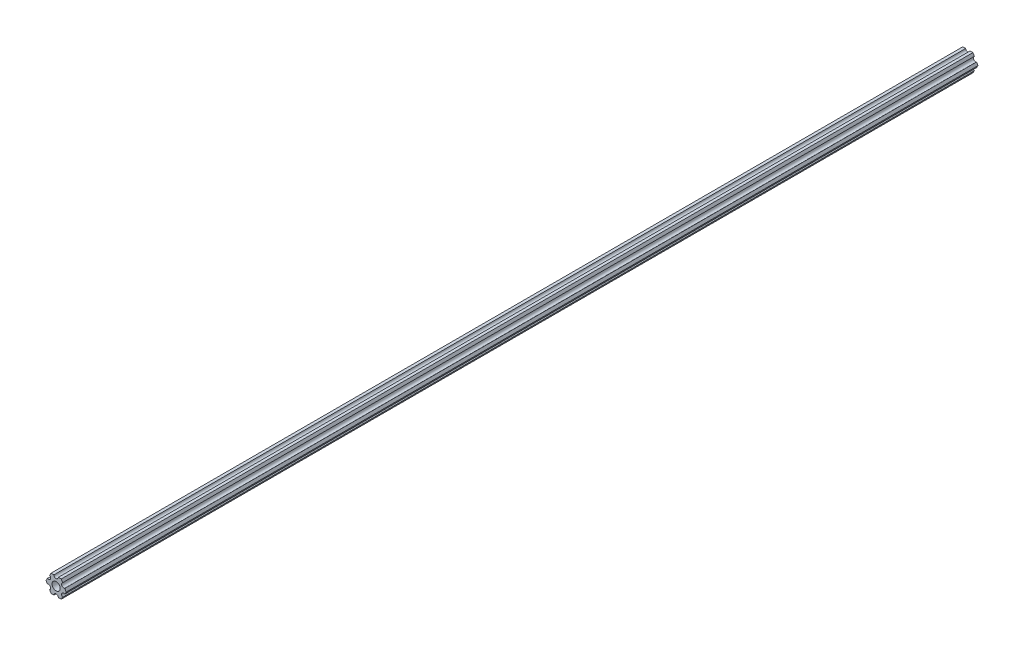
ISO-10303-21;
HEADER;
FILE_DESCRIPTION(('STEP AP214'),'2;1');
FILE_NAME('part.step','',(''),(''),'','','');
FILE_SCHEMA(('AUTOMOTIVE_DESIGN { 1 0 10303 214 1 1 1 1 }'));
ENDSEC;
DATA;
#1=APPLICATION_CONTEXT('core data for automotive mechanical design processes');
#2=APPLICATION_PROTOCOL_DEFINITION('international standard','automotive_design',2000,#1);
#3=PRODUCT_CONTEXT('',#1,'mechanical');
#4=PRODUCT('Part','Part','',(#3));
#5=PRODUCT_RELATED_PRODUCT_CATEGORY('part','',(#4));
#6=PRODUCT_DEFINITION_FORMATION('','',#4);
#7=PRODUCT_DEFINITION_CONTEXT('part definition',#1,'design');
#8=PRODUCT_DEFINITION('design','',#6,#7);
#9=PRODUCT_DEFINITION_SHAPE('','',#8);
#10=(LENGTH_UNIT() NAMED_UNIT(*) SI_UNIT(.MILLI.,.METRE.));
#11=(NAMED_UNIT(*) PLANE_ANGLE_UNIT() SI_UNIT($,.RADIAN.));
#12=(NAMED_UNIT(*) SI_UNIT($,.STERADIAN.) SOLID_ANGLE_UNIT());
#13=UNCERTAINTY_MEASURE_WITH_UNIT(LENGTH_MEASURE(1.E-05),#10,'distance_accuracy_value','');
#14=(GEOMETRIC_REPRESENTATION_CONTEXT(3) GLOBAL_UNCERTAINTY_ASSIGNED_CONTEXT((#13)) GLOBAL_UNIT_ASSIGNED_CONTEXT((#10,
#11,#12)) REPRESENTATION_CONTEXT('',''));
#15=CARTESIAN_POINT('',(0.,0.,0.));
#16=DIRECTION('',(0.,0.,1.));
#17=DIRECTION('',(1.,0.,0.));
#18=AXIS2_PLACEMENT_3D('',#15,#16,#17);
#19=CARTESIAN_POINT('',(6.29301142309098,-1.80018429024546,85.725));
#20=DIRECTION('',(-0.866025434075723,0.499999947533953,0.));
#21=DIRECTION('',(0.,0.,1.));
#22=AXIS2_PLACEMENT_3D('',#19,#20,#21);
#23=PLANE('',#22);
#24=DIRECTION('',(0.,0.,1.));
#25=VECTOR('',#24,1.);
#26=CARTESIAN_POINT('',(7.33234841870827,4.44212519169686E-07,85.725));
#27=LINE('',#26,#25);
#28=CARTESIAN_POINT('',(7.33234841870826,4.44212518961143E-07,-574.675));
#29=VERTEX_POINT('',#28);
#30=CARTESIAN_POINT('',(7.33234841870826,4.44212519315656E-07,85.725));
#31=VERTEX_POINT('',#30);
#32=EDGE_CURVE('E11',#29,#31,#27,.T.);
#33=ORIENTED_EDGE('',*,*,#32,.T.);
#34=DIRECTION('',(0.499999947533953,0.866025434075723,0.));
#35=VECTOR('',#34,1.);
#36=CARTESIAN_POINT('',(6.29301142309098,-1.80018429024546,85.725));
#37=LINE('',#36,#35);
#38=CARTESIAN_POINT('',(6.29301142309098,-1.80018429024546,85.725));
#39=VERTEX_POINT('',#38);
#40=EDGE_CURVE('E301',#39,#31,#37,.T.);
#41=ORIENTED_EDGE('',*,*,#40,.F.);
#42=DIRECTION('',(0.,0.,-1.));
#43=VECTOR('',#42,1.);
#44=CARTESIAN_POINT('',(6.29301142309098,-1.80018429024546,85.725));
#45=LINE('',#44,#43);
#46=CARTESIAN_POINT('',(6.29301142309098,-1.80018429024546,-574.675));
#47=VERTEX_POINT('',#46);
#48=EDGE_CURVE('E300',#39,#47,#45,.T.);
#49=ORIENTED_EDGE('',*,*,#48,.T.);
#50=DIRECTION('',(-0.499999947533953,-0.866025434075723,0.));
#51=VECTOR('',#50,1.);
#52=CARTESIAN_POINT('',(6.29301142309098,-1.80018429024546,-574.675));
#53=LINE('',#52,#51);
#54=EDGE_CURVE('E219',#29,#47,#53,.T.);
#55=ORIENTED_EDGE('',*,*,#54,.F.);
#56=EDGE_LOOP('',(#33,#41,#49,#55));
#57=FACE_BOUND('',#56,.T.);
#58=ADVANCED_FACE('F51',(#57),#23,.F.);
#59=CARTESIAN_POINT('',(7.33234841870827,4.44212519169686E-07,85.725));
#60=DIRECTION('',(-0.866025373493145,-0.500000052466057,0.));
#61=DIRECTION('',(-0.500000052466057,0.866025373493145,0.));
#62=AXIS2_PLACEMENT_3D('',#59,#60,#61);
#63=PLANE('',#62);
#64=DIRECTION('',(0.,0.,1.));
#65=VECTOR('',#64,1.);
#66=CARTESIAN_POINT('',(6.29301120497139,1.80018505273894,85.725));
#67=LINE('',#66,#65);
#68=CARTESIAN_POINT('',(6.29301120497139,1.80018505273894,-574.675));
#69=VERTEX_POINT('',#68);
#70=CARTESIAN_POINT('',(6.29301120497139,1.80018505273894,85.725));
#71=VERTEX_POINT('',#70);
#72=EDGE_CURVE('E59',#69,#71,#67,.T.);
#73=ORIENTED_EDGE('',*,*,#72,.T.);
#74=DIRECTION('',(-0.500000052466057,0.866025373493145,0.));
#75=VECTOR('',#74,1.);
#76=CARTESIAN_POINT('',(7.33234841870827,4.44212519198906E-07,85.725));
#77=LINE('',#76,#75);
#78=EDGE_CURVE('E305',#31,#71,#77,.T.);
#79=ORIENTED_EDGE('',*,*,#78,.F.);
#80=ORIENTED_EDGE('',*,*,#32,.F.);
#81=DIRECTION('',(0.500000052466055,-0.866025373493145,0.));
#82=VECTOR('',#81,1.);
#83=CARTESIAN_POINT('',(7.33234841870826,4.44212518961143E-07,-574.675));
#84=LINE('',#83,#82);
#85=EDGE_CURVE('E213',#69,#29,#84,.T.);
#86=ORIENTED_EDGE('',*,*,#85,.F.);
#87=EDGE_LOOP('',(#73,#79,#80,#86));
#88=FACE_BOUND('',#87,.T.);
#89=ADVANCED_FACE('F214',(#88),#63,.F.);
#90=CARTESIAN_POINT('',(4.70551103839172,4.54981561357972,85.725));
#91=DIRECTION('',(-0.866025373493151,-0.500000052466046,0.));
#92=DIRECTION('',(-0.500000052466046,0.866025373493151,0.));
#93=AXIS2_PLACEMENT_3D('',#90,#91,#92);
#94=PLANE('',#93);
#95=DIRECTION('',(0.,0.,1.));
#96=VECTOR('',#95,1.);
#97=CARTESIAN_POINT('',(3.66617382465481,6.35000022210627,85.725));
#98=LINE('',#97,#96);
#99=CARTESIAN_POINT('',(3.66617382465481,6.35000022210627,-574.675));
#100=VERTEX_POINT('',#99);
#101=CARTESIAN_POINT('',(3.66617382465481,6.35000022210627,85.725));
#102=VERTEX_POINT('',#101);
#103=EDGE_CURVE('E211',#100,#102,#98,.T.);
#104=ORIENTED_EDGE('',*,*,#103,.T.);
#105=DIRECTION('',(-0.500000052466046,0.866025373493151,0.));
#106=VECTOR('',#105,1.);
#107=CARTESIAN_POINT('',(4.70551103839172,4.54981561357972,85.725));
#108=LINE('',#107,#106);
#109=CARTESIAN_POINT('',(4.70551103839172,4.54981561357972,85.725));
#110=VERTEX_POINT('',#109);
#111=EDGE_CURVE('E336',#110,#102,#108,.T.);
#112=ORIENTED_EDGE('',*,*,#111,.F.);
#113=DIRECTION('',(0.,0.,1.));
#114=VECTOR('',#113,1.);
#115=CARTESIAN_POINT('',(4.70551103839172,4.54981561357972,85.725));
#116=LINE('',#115,#114);
#117=CARTESIAN_POINT('',(4.70551103839172,4.54981561357972,-574.675));
#118=VERTEX_POINT('',#117);
#119=EDGE_CURVE('E299',#118,#110,#116,.T.);
#120=ORIENTED_EDGE('',*,*,#119,.F.);
#121=DIRECTION('',(0.500000052466045,-0.866025373493151,0.));
#122=VECTOR('',#121,1.);
#123=CARTESIAN_POINT('',(4.70551103839172,4.54981561357972,-574.675));
#124=LINE('',#123,#122);
#125=EDGE_CURVE('E225',#100,#118,#124,.T.);
#126=ORIENTED_EDGE('',*,*,#125,.F.);
#127=EDGE_LOOP('',(#104,#112,#120,#126));
#128=FACE_BOUND('',#127,.T.);
#129=ADVANCED_FACE('F412',(#128),#94,.F.);
#130=CARTESIAN_POINT('',(3.66617382465481,6.35000022210627,85.725));
#131=DIRECTION('',(6.05825850611185E-08,-1.,0.));
#132=DIRECTION('',(0.,0.,-1.));
#133=AXIS2_PLACEMENT_3D('',#130,#131,#132);
#134=PLANE('',#133);
#135=DIRECTION('',(0.,0.,1.));
#136=VECTOR('',#135,1.);
#137=CARTESIAN_POINT('',(1.58749961530074,6.35000009617482,85.725));
#138=LINE('',#137,#136);
#139=CARTESIAN_POINT('',(1.58749961530073,6.35000015914054,-574.675));
#140=VERTEX_POINT('',#139);
#141=CARTESIAN_POINT('',(1.58749961530073,6.35000015914054,85.725));
#142=VERTEX_POINT('',#141);
#143=EDGE_CURVE('E333',#140,#142,#138,.T.);
#144=ORIENTED_EDGE('',*,*,#143,.T.);
#145=DIRECTION('',(-1.,0.,0.));
#146=VECTOR('',#145,1.);
#147=CARTESIAN_POINT('',(5.49926112168156,6.35000022210627,85.725));
#148=LINE('',#147,#146);
#149=EDGE_CURVE('E340',#102,#142,#148,.T.);
#150=ORIENTED_EDGE('',*,*,#149,.F.);
#151=ORIENTED_EDGE('',*,*,#103,.F.);
#152=DIRECTION('',(1.,3.02912931564594E-08,0.));
#153=VECTOR('',#152,1.);
#154=CARTESIAN_POINT('',(3.66617382465481,6.35000022210627,-574.675));
#155=LINE('',#154,#153);
#156=EDGE_CURVE('E287',#140,#100,#155,.T.);
#157=ORIENTED_EDGE('',*,*,#156,.F.);
#158=EDGE_LOOP('',(#144,#150,#151,#157));
#159=FACE_BOUND('',#158,.T.);
#160=ADVANCED_FACE('F415',(#159),#134,.F.);
#161=CARTESIAN_POINT('',(-3.84699260060323E-07,6.35,85.725));
#162=DIRECTION('',(0.,0.,-1.));
#163=DIRECTION('',(-1.,0.,0.));
#164=AXIS2_PLACEMENT_3D('',#161,#162,#163);
#165=CYLINDRICAL_SURFACE('',#164,1.5875);
#166=DIRECTION('',(0.,0.,1.));
#167=VECTOR('',#166,1.);
#168=CARTESIAN_POINT('',(-1.58750038469926,6.34999990382518,85.725));
#169=LINE('',#168,#167);
#170=CARTESIAN_POINT('',(-1.58750038469926,6.34999990382519,-574.675));
#171=VERTEX_POINT('',#170);
#172=CARTESIAN_POINT('',(-1.58750038469926,6.34999990382519,85.725));
#173=VERTEX_POINT('',#172);
#174=EDGE_CURVE('E330',#171,#173,#169,.T.);
#175=ORIENTED_EDGE('',*,*,#174,.T.);
#176=CARTESIAN_POINT('',(-3.84699260060323E-07,6.35,85.725));
#177=DIRECTION('',(0.,0.,-1.));
#178=DIRECTION('',(-1.,0.,0.));
#179=AXIS2_PLACEMENT_3D('',#176,#177,#178);
#180=CIRCLE('',#179,1.5875);
#181=EDGE_CURVE('E344',#142,#173,#180,.T.);
#182=ORIENTED_EDGE('',*,*,#181,.F.);
#183=ORIENTED_EDGE('',*,*,#143,.F.);
#184=CARTESIAN_POINT('',(-3.84699260060323E-07,6.35,-574.675));
#185=DIRECTION('',(0.,0.,1.));
#186=DIRECTION('',(-1.,0.,0.));
#187=AXIS2_PLACEMENT_3D('',#184,#185,#186);
#188=CIRCLE('',#187,1.5875);
#189=EDGE_CURVE('E283',#171,#140,#188,.T.);
#190=ORIENTED_EDGE('',*,*,#189,.F.);
#191=EDGE_LOOP('',(#175,#182,#183,#190));
#192=FACE_BOUND('',#191,.T.);
#193=ADVANCED_FACE('F464',(#192),#165,.F.);
#194=CARTESIAN_POINT('',(-1.58750038469926,6.34999990382518,85.725));
#195=DIRECTION('',(6.05825963273174E-08,-1.,0.));
#196=DIRECTION('',(0.,0.,-1.));
#197=AXIS2_PLACEMENT_3D('',#194,#195,#196);
#198=PLANE('',#197);
#199=DIRECTION('',(0.,0.,1.));
#200=VECTOR('',#199,1.);
#201=CARTESIAN_POINT('',(-3.66617459405349,6.3499997778937,85.725));
#202=LINE('',#201,#200);
#203=CARTESIAN_POINT('',(-3.66617454558244,6.34999986184803,-574.675));
#204=VERTEX_POINT('',#203);
#205=CARTESIAN_POINT('',(-3.66617454558244,6.34999986184803,85.725));
#206=VERTEX_POINT('',#205);
#207=EDGE_CURVE('E323',#204,#206,#202,.T.);
#208=ORIENTED_EDGE('',*,*,#207,.T.);
#209=DIRECTION('',(-1.,0.,0.));
#210=VECTOR('',#209,1.);
#211=CARTESIAN_POINT('',(5.49926112168156,6.34999990382519,85.725));
#212=LINE('',#211,#210);
#213=EDGE_CURVE('E348',#173,#206,#212,.T.);
#214=ORIENTED_EDGE('',*,*,#213,.F.);
#215=ORIENTED_EDGE('',*,*,#174,.F.);
#216=DIRECTION('',(1.,2.0194198968488E-08,0.));
#217=VECTOR('',#216,1.);
#218=CARTESIAN_POINT('',(-1.58750038469926,6.34999990382519,-574.675));
#219=LINE('',#218,#217);
#220=EDGE_CURVE('E279',#204,#171,#219,.T.);
#221=ORIENTED_EDGE('',*,*,#220,.F.);
#222=EDGE_LOOP('',(#208,#214,#215,#221));
#223=FACE_BOUND('',#222,.T.);
#224=ADVANCED_FACE('F461',(#223),#198,.F.);
#225=CARTESIAN_POINT('',(-3.66617459405349,6.3499997778937,85.725));
#226=DIRECTION('',(0.866025434075729,-0.499999947533942,0.));
#227=DIRECTION('',(0.,0.,-1.));
#228=AXIS2_PLACEMENT_3D('',#225,#226,#227);
#229=PLANE('',#228);
#230=DIRECTION('',(0.,0.,1.));
#231=VECTOR('',#230,1.);
#232=CARTESIAN_POINT('',(-4.70551158967065,4.54981504343587,85.725));
#233=LINE('',#232,#231);
#234=CARTESIAN_POINT('',(-4.70551158967065,4.54981504343587,-574.675));
#235=VERTEX_POINT('',#234);
#236=CARTESIAN_POINT('',(-4.70551158967065,4.54981504343587,85.725));
#237=VERTEX_POINT('',#236);
#238=EDGE_CURVE('E320',#235,#237,#233,.T.);
#239=ORIENTED_EDGE('',*,*,#238,.T.);
#240=DIRECTION('',(-0.499999947533943,-0.866025434075729,0.));
#241=VECTOR('',#240,1.);
#242=CARTESIAN_POINT('',(-3.66617459405349,6.3499997778937,85.725));
#243=LINE('',#242,#241);
#244=EDGE_CURVE('E352',#206,#237,#243,.T.);
#245=ORIENTED_EDGE('',*,*,#244,.F.);
#246=ORIENTED_EDGE('',*,*,#207,.F.);
#247=DIRECTION('',(0.499999947533939,0.866025434075731,0.));
#248=VECTOR('',#247,1.);
#249=CARTESIAN_POINT('',(-3.66617454558244,6.34999986184803,-574.675));
#250=LINE('',#249,#248);
#251=EDGE_CURVE('E275',#235,#204,#250,.T.);
#252=ORIENTED_EDGE('',*,*,#251,.F.);
#253=EDGE_LOOP('',(#239,#245,#246,#252));
#254=FACE_BOUND('',#253,.T.);
#255=ADVANCED_FACE('F457',(#254),#229,.F.);
#256=CARTESIAN_POINT('',(-5.49926150638082,3.17499966684067,85.725));
#257=DIRECTION('',(0.,0.,-1.));
#258=DIRECTION('',(-1.,0.,0.));
#259=AXIS2_PLACEMENT_3D('',#256,#257,#258);
#260=CYLINDRICAL_SURFACE('',#259,1.5875);
#261=DIRECTION('',(0.,0.,1.));
#262=VECTOR('',#261,1.);
#263=CARTESIAN_POINT('',(-6.29301142309098,1.80018429024547,85.725));
#264=LINE('',#263,#262);
#265=CARTESIAN_POINT('',(-6.29301142309098,1.80018429024546,-574.675));
#266=VERTEX_POINT('',#265);
#267=CARTESIAN_POINT('',(-6.29301142309098,1.80018429024547,85.725));
#268=VERTEX_POINT('',#267);
#269=EDGE_CURVE('E324',#266,#268,#264,.T.);
#270=ORIENTED_EDGE('',*,*,#269,.T.);
#271=CARTESIAN_POINT('',(-5.49926150638082,3.17499966684067,85.725));
#272=DIRECTION('',(0.,0.,-1.));
#273=DIRECTION('',(-1.,0.,0.));
#274=AXIS2_PLACEMENT_3D('',#271,#272,#273);
#275=CIRCLE('',#274,1.5875);
#276=EDGE_CURVE('E362',#237,#268,#275,.T.);
#277=ORIENTED_EDGE('',*,*,#276,.F.);
#278=ORIENTED_EDGE('',*,*,#238,.F.);
#279=CARTESIAN_POINT('',(-5.49926150638082,3.17499966684067,-574.675));
#280=DIRECTION('',(0.,0.,1.));
#281=DIRECTION('',(-1.,0.,0.));
#282=AXIS2_PLACEMENT_3D('',#279,#280,#281);
#283=CIRCLE('',#282,1.5875);
#284=EDGE_CURVE('E271',#266,#235,#283,.T.);
#285=ORIENTED_EDGE('',*,*,#284,.F.);
#286=EDGE_LOOP('',(#270,#277,#278,#285));
#287=FACE_BOUND('',#286,.T.);
#288=ADVANCED_FACE('F453',(#287),#260,.F.);
#289=CARTESIAN_POINT('',(-6.29301142309098,1.80018429024547,85.725));
#290=DIRECTION('',(0.866025434075724,-0.499999947533952,0.));
#291=DIRECTION('',(0.,0.,-1.));
#292=AXIS2_PLACEMENT_3D('',#289,#290,#291);
#293=PLANE('',#292);
#294=DIRECTION('',(0.,0.,1.));
#295=VECTOR('',#294,1.);
#296=CARTESIAN_POINT('',(-7.33234841870827,-4.44212523790841E-07,85.725));
#297=LINE('',#296,#295);
#298=CARTESIAN_POINT('',(-7.33234841870826,-4.44212524036367E-07,-574.675));
#299=VERTEX_POINT('',#298);
#300=CARTESIAN_POINT('',(-7.33234841870826,-4.44212524036367E-07,85.725));
#301=VERTEX_POINT('',#300);
#302=EDGE_CURVE('E317',#299,#301,#297,.T.);
#303=ORIENTED_EDGE('',*,*,#302,.T.);
#304=DIRECTION('',(-0.499999947533952,-0.866025434075724,0.));
#305=VECTOR('',#304,1.);
#306=CARTESIAN_POINT('',(-6.29301142309098,1.80018429024547,85.725));
#307=LINE('',#306,#305);
#308=EDGE_CURVE('E358',#268,#301,#307,.T.);
#309=ORIENTED_EDGE('',*,*,#308,.F.);
#310=ORIENTED_EDGE('',*,*,#269,.F.);
#311=DIRECTION('',(0.499999947533951,0.866025434075724,0.));
#312=VECTOR('',#311,1.);
#313=CARTESIAN_POINT('',(-6.29301142309098,1.80018429024547,-574.675));
#314=LINE('',#313,#312);
#315=EDGE_CURVE('E267',#299,#266,#314,.T.);
#316=ORIENTED_EDGE('',*,*,#315,.F.);
#317=EDGE_LOOP('',(#303,#309,#310,#316));
#318=FACE_BOUND('',#317,.T.);
#319=ADVANCED_FACE('F449',(#318),#293,.F.);
#320=CARTESIAN_POINT('',(-7.33234841870827,-4.44212523790841E-07,85.725));
#321=DIRECTION('',(0.866025373493151,0.500000052466045,0.));
#322=DIRECTION('',(0.,0.,-1.));
#323=AXIS2_PLACEMENT_3D('',#320,#321,#322);
#324=PLANE('',#323);
#325=DIRECTION('',(0.,0.,1.));
#326=VECTOR('',#325,1.);
#327=CARTESIAN_POINT('',(-6.29301120497141,-1.80018505273897,85.725));
#328=LINE('',#327,#326);
#329=CARTESIAN_POINT('',(-6.29301120497141,-1.80018505273897,-574.675));
#330=VERTEX_POINT('',#329);
#331=CARTESIAN_POINT('',(-6.29301120497141,-1.80018505273897,85.725));
#332=VERTEX_POINT('',#331);
#333=EDGE_CURVE('E310',#330,#332,#328,.T.);
#334=ORIENTED_EDGE('',*,*,#333,.T.);
#335=DIRECTION('',(0.500000052466045,-0.866025373493151,0.));
#336=VECTOR('',#335,1.);
#337=CARTESIAN_POINT('',(-7.33234841870827,-4.44212523969395E-07,85.725));
#338=LINE('',#337,#336);
#339=EDGE_CURVE('E353',#301,#332,#338,.T.);
#340=ORIENTED_EDGE('',*,*,#339,.F.);
#341=ORIENTED_EDGE('',*,*,#302,.F.);
#342=DIRECTION('',(-0.500000052466045,0.866025373493152,0.));
#343=VECTOR('',#342,1.);
#344=CARTESIAN_POINT('',(-7.33234841870826,-4.44212524036367E-07,-574.675));
#345=LINE('',#344,#343);
#346=EDGE_CURVE('E263',#330,#299,#345,.T.);
#347=ORIENTED_EDGE('',*,*,#346,.F.);
#348=EDGE_LOOP('',(#334,#340,#341,#347));
#349=FACE_BOUND('',#348,.T.);
#350=ADVANCED_FACE('F445',(#349),#324,.F.);
#351=CARTESIAN_POINT('',(-5.49926112168156,-3.17500033315934,85.725));
#352=DIRECTION('',(0.,0.,-1.));
#353=DIRECTION('',(-1.,0.,0.));
#354=AXIS2_PLACEMENT_3D('',#351,#352,#353);
#355=CYLINDRICAL_SURFACE('',#354,1.5875);
#356=DIRECTION('',(0.,0.,1.));
#357=VECTOR('',#356,1.);
#358=CARTESIAN_POINT('',(-4.70551103839172,-4.54981561357972,85.725));
#359=LINE('',#358,#357);
#360=CARTESIAN_POINT('',(-4.70551103839172,-4.54981561357972,-574.675));
#361=VERTEX_POINT('',#360);
#362=CARTESIAN_POINT('',(-4.70551103839172,-4.54981561357972,85.725));
#363=VERTEX_POINT('',#362);
#364=EDGE_CURVE('E307',#361,#363,#359,.T.);
#365=ORIENTED_EDGE('',*,*,#364,.T.);
#366=CARTESIAN_POINT('',(-5.49926112168156,-3.17500033315934,85.725));
#367=DIRECTION('',(0.,0.,-1.));
#368=DIRECTION('',(-1.,0.,0.));
#369=AXIS2_PLACEMENT_3D('',#366,#367,#368);
#370=CIRCLE('',#369,1.5875);
#371=EDGE_CURVE('E357',#332,#363,#370,.T.);
#372=ORIENTED_EDGE('',*,*,#371,.F.);
#373=ORIENTED_EDGE('',*,*,#333,.F.);
#374=CARTESIAN_POINT('',(-5.49926112168156,-3.17500033315934,-574.675));
#375=DIRECTION('',(0.,0.,1.));
#376=DIRECTION('',(-1.,0.,0.));
#377=AXIS2_PLACEMENT_3D('',#374,#375,#376);
#378=CIRCLE('',#377,1.5875);
#379=EDGE_CURVE('E259',#361,#330,#378,.T.);
#380=ORIENTED_EDGE('',*,*,#379,.F.);
#381=EDGE_LOOP('',(#365,#372,#373,#380));
#382=FACE_BOUND('',#381,.T.);
#383=ADVANCED_FACE('F441',(#382),#355,.F.);
#384=CARTESIAN_POINT('',(-4.70551103839172,-4.54981561357972,85.725));
#385=DIRECTION('',(0.866025373493152,0.500000052466045,0.));
#386=DIRECTION('',(0.,0.,-1.));
#387=AXIS2_PLACEMENT_3D('',#384,#385,#386);
#388=PLANE('',#387);
#389=DIRECTION('',(0.,0.,1.));
#390=VECTOR('',#389,1.);
#391=CARTESIAN_POINT('',(-3.66617382465481,-6.35000022210628,85.725));
#392=LINE('',#391,#390);
#393=CARTESIAN_POINT('',(-3.66617382465481,-6.35000022210628,-574.675));
#394=VERTEX_POINT('',#393);
#395=CARTESIAN_POINT('',(-3.66617382465481,-6.35000022210628,85.725));
#396=VERTEX_POINT('',#395);
#397=EDGE_CURVE('E311',#394,#396,#392,.T.);
#398=ORIENTED_EDGE('',*,*,#397,.T.);
#399=DIRECTION('',(0.500000052466045,-0.866025373493151,0.));
#400=VECTOR('',#399,1.);
#401=CARTESIAN_POINT('',(-4.70551103839172,-4.54981561357972,85.725));
#402=LINE('',#401,#400);
#403=EDGE_CURVE('E372',#363,#396,#402,.T.);
#404=ORIENTED_EDGE('',*,*,#403,.F.);
#405=ORIENTED_EDGE('',*,*,#364,.F.);
#406=DIRECTION('',(-0.500000052466043,0.866025373493152,0.));
#407=VECTOR('',#406,1.);
#408=CARTESIAN_POINT('',(-4.70551103839172,-4.54981561357972,-574.675));
#409=LINE('',#408,#407);
#410=EDGE_CURVE('E255',#394,#361,#409,.T.);
#411=ORIENTED_EDGE('',*,*,#410,.F.);
#412=EDGE_LOOP('',(#398,#404,#405,#411));
#413=FACE_BOUND('',#412,.T.);
#414=ADVANCED_FACE('F437',(#413),#388,.F.);
#415=CARTESIAN_POINT('',(-3.66617382465481,-6.35000022210628,85.725));
#416=DIRECTION('',(-6.05825854783851E-08,1.,0.));
#417=DIRECTION('',(0.,0.,1.));
#418=AXIS2_PLACEMENT_3D('',#415,#416,#417);
#419=PLANE('',#418);
#420=DIRECTION('',(0.,0.,1.));
#421=VECTOR('',#420,1.);
#422=CARTESIAN_POINT('',(-1.58749961530074,-6.35,85.725));
#423=LINE('',#422,#421);
#424=CARTESIAN_POINT('',(-1.58749961530073,-6.35000011105314,-574.675));
#425=VERTEX_POINT('',#424);
#426=CARTESIAN_POINT('',(-1.58749961530073,-6.35000011105314,85.725));
#427=VERTEX_POINT('',#426);
#428=EDGE_CURVE('E82',#425,#427,#423,.T.);
#429=ORIENTED_EDGE('',*,*,#428,.T.);
#430=DIRECTION('',(1.,0.,0.));
#431=VECTOR('',#430,1.);
#432=CARTESIAN_POINT('',(5.49926112168156,-6.35000022210628,85.725));
#433=LINE('',#432,#431);
#434=EDGE_CURVE('E376',#396,#427,#433,.T.);
#435=ORIENTED_EDGE('',*,*,#434,.F.);
#436=ORIENTED_EDGE('',*,*,#397,.F.);
#437=DIRECTION('',(-0.999999999999999,-5.34249856349036E-08,0.));
#438=VECTOR('',#437,1.);
#439=CARTESIAN_POINT('',(-3.66617382465481,-6.35000022210628,-574.675));
#440=LINE('',#439,#438);
#441=EDGE_CURVE('E251',#425,#394,#440,.T.);
#442=ORIENTED_EDGE('',*,*,#441,.F.);
#443=EDGE_LOOP('',(#429,#435,#436,#442));
#444=FACE_BOUND('',#443,.T.);
#445=ADVANCED_FACE('F434',(#444),#419,.F.);
#446=CARTESIAN_POINT('',(3.8469926204343E-07,-6.35,85.725));
#447=DIRECTION('',(0.,0.,-1.));
#448=DIRECTION('',(-1.,0.,0.));
#449=AXIS2_PLACEMENT_3D('',#446,#447,#448);
#450=CYLINDRICAL_SURFACE('',#449,1.5875);
#451=DIRECTION('',(0.,0.,1.));
#452=VECTOR('',#451,1.);
#453=CARTESIAN_POINT('',(1.58750038469926,-6.34999990382518,85.725));
#454=LINE('',#453,#452);
#455=CARTESIAN_POINT('',(1.58750038469926,-6.34999990382519,-574.675));
#456=VERTEX_POINT('',#455);
#457=CARTESIAN_POINT('',(1.58750038469926,-6.34999990382519,85.725));
#458=VERTEX_POINT('',#457);
#459=EDGE_CURVE('E71',#456,#458,#454,.T.);
#460=ORIENTED_EDGE('',*,*,#459,.T.);
#461=CARTESIAN_POINT('',(3.8469926204343E-07,-6.35,85.725));
#462=DIRECTION('',(0.,0.,-1.));
#463=DIRECTION('',(-1.,0.,0.));
#464=AXIS2_PLACEMENT_3D('',#461,#462,#463);
#465=CIRCLE('',#464,1.5875);
#466=EDGE_CURVE('E380',#427,#458,#465,.T.);
#467=ORIENTED_EDGE('',*,*,#466,.F.);
#468=ORIENTED_EDGE('',*,*,#428,.F.);
#469=CARTESIAN_POINT('',(3.8469926204343E-07,-6.35,-574.675));
#470=DIRECTION('',(0.,0.,1.));
#471=DIRECTION('',(-1.,0.,0.));
#472=AXIS2_PLACEMENT_3D('',#469,#470,#471);
#473=CIRCLE('',#472,1.5875);
#474=EDGE_CURVE('E247',#456,#425,#473,.T.);
#475=ORIENTED_EDGE('',*,*,#474,.F.);
#476=EDGE_LOOP('',(#460,#467,#468,#475));
#477=FACE_BOUND('',#476,.T.);
#478=ADVANCED_FACE('F432',(#477),#450,.F.);
#479=CARTESIAN_POINT('',(1.58750038469926,-6.34999990382518,85.725));
#480=DIRECTION('',(-6.05825721258438E-08,1.,0.));
#481=DIRECTION('',(0.,0.,1.));
#482=AXIS2_PLACEMENT_3D('',#479,#480,#481);
#483=PLANE('',#482);
#484=DIRECTION('',(0.,0.,1.));
#485=VECTOR('',#484,1.);
#486=CARTESIAN_POINT('',(3.66617459405346,-6.34999977789375,85.725));
#487=LINE('',#486,#485);
#488=CARTESIAN_POINT('',(3.66617454558244,-6.34999986184804,-574.675));
#489=VERTEX_POINT('',#488);
#490=CARTESIAN_POINT('',(3.66617454558244,-6.34999986184804,85.725));
#491=VERTEX_POINT('',#490);
#492=EDGE_CURVE('E381',#489,#491,#487,.T.);
#493=ORIENTED_EDGE('',*,*,#492,.T.);
#494=DIRECTION('',(1.,0.,0.));
#495=VECTOR('',#494,1.);
#496=CARTESIAN_POINT('',(5.49926112168156,-6.34999990382519,85.725));
#497=LINE('',#496,#495);
#498=EDGE_CURVE('E388',#458,#491,#497,.T.);
#499=ORIENTED_EDGE('',*,*,#498,.F.);
#500=ORIENTED_EDGE('',*,*,#459,.F.);
#501=DIRECTION('',(-1.,-2.01941943785532E-08,0.));
#502=VECTOR('',#501,1.);
#503=CARTESIAN_POINT('',(1.58750038469926,-6.34999990382519,-574.675));
#504=LINE('',#503,#502);
#505=EDGE_CURVE('E243',#489,#456,#504,.T.);
#506=ORIENTED_EDGE('',*,*,#505,.F.);
#507=EDGE_LOOP('',(#493,#499,#500,#506));
#508=FACE_BOUND('',#507,.T.);
#509=ADVANCED_FACE('F431',(#508),#483,.F.);
#510=CARTESIAN_POINT('',(3.66617459405346,-6.34999977789375,85.725));
#511=DIRECTION('',(-0.86602543407573,0.499999947533941,0.));
#512=DIRECTION('',(0.,0.,1.));
#513=AXIS2_PLACEMENT_3D('',#510,#511,#512);
#514=PLANE('',#513);
#515=DIRECTION('',(0.,0.,-1.));
#516=VECTOR('',#515,1.);
#517=CARTESIAN_POINT('',(4.70551158967065,-4.54981504343587,85.725));
#518=LINE('',#517,#516);
#519=CARTESIAN_POINT('',(4.70551158967065,-4.54981504343587,85.725));
#520=VERTEX_POINT('',#519);
#521=CARTESIAN_POINT('',(4.70551158967065,-4.54981504343587,-574.675));
#522=VERTEX_POINT('',#521);
#523=EDGE_CURVE('E384',#520,#522,#518,.T.);
#524=ORIENTED_EDGE('',*,*,#523,.F.);
#525=DIRECTION('',(0.49999994753394,0.86602543407573,0.));
#526=VECTOR('',#525,1.);
#527=CARTESIAN_POINT('',(3.66617459405346,-6.34999977789376,85.725));
#528=LINE('',#527,#526);
#529=EDGE_CURVE('E306',#491,#520,#528,.T.);
#530=ORIENTED_EDGE('',*,*,#529,.F.);
#531=ORIENTED_EDGE('',*,*,#492,.F.);
#532=DIRECTION('',(-0.499999947533941,-0.86602543407573,0.));
#533=VECTOR('',#532,1.);
#534=CARTESIAN_POINT('',(3.66617454558244,-6.34999986184804,-574.675));
#535=LINE('',#534,#533);
#536=EDGE_CURVE('E239',#522,#489,#535,.T.);
#537=ORIENTED_EDGE('',*,*,#536,.F.);
#538=EDGE_LOOP('',(#524,#530,#531,#537));
#539=FACE_BOUND('',#538,.T.);
#540=ADVANCED_FACE('F428',(#539),#514,.F.);
#541=CARTESIAN_POINT('',(5.49926112168156,3.17500033315934,85.725));
#542=DIRECTION('',(0.,0.,1.));
#543=DIRECTION('',(1.,0.,0.));
#544=AXIS2_PLACEMENT_3D('',#541,#542,#543);
#545=PLANE('',#544);
#546=CARTESIAN_POINT('',(0.,0.,85.725));
#547=DIRECTION('',(0.,0.,-1.));
#548=DIRECTION('',(-1.,0.,0.));
#549=AXIS2_PLACEMENT_3D('',#546,#547,#548);
#550=CIRCLE('',#549,2.9337);
#551=CARTESIAN_POINT('',(-2.9337,0.,85.725));
#552=VERTEX_POINT('',#551);
#553=EDGE_CURVE('E292',#552,#552,#550,.T.);
#554=ORIENTED_EDGE('',*,*,#553,.T.);
#555=EDGE_LOOP('',(#554));
#556=FACE_BOUND('',#555,.T.);
#557=ORIENTED_EDGE('',*,*,#529,.T.);
#558=CARTESIAN_POINT('',(5.49926150638082,-3.17499966684067,85.725));
#559=DIRECTION('',(0.,0.,-1.));
#560=DIRECTION('',(-1.,0.,0.));
#561=AXIS2_PLACEMENT_3D('',#558,#559,#560);
#562=CIRCLE('',#561,1.5875);
#563=EDGE_CURVE('E296',#520,#39,#562,.T.);
#564=ORIENTED_EDGE('',*,*,#563,.T.);
#565=ORIENTED_EDGE('',*,*,#40,.T.);
#566=ORIENTED_EDGE('',*,*,#78,.T.);
#567=CARTESIAN_POINT('',(5.49926112168156,3.17500033315934,85.725));
#568=DIRECTION('',(0.,0.,-1.));
#569=DIRECTION('',(-1.,0.,0.));
#570=AXIS2_PLACEMENT_3D('',#567,#568,#569);
#571=CIRCLE('',#570,1.5875);
#572=EDGE_CURVE('E206',#71,#110,#571,.T.);
#573=ORIENTED_EDGE('',*,*,#572,.T.);
#574=ORIENTED_EDGE('',*,*,#111,.T.);
#575=ORIENTED_EDGE('',*,*,#149,.T.);
#576=ORIENTED_EDGE('',*,*,#181,.T.);
#577=ORIENTED_EDGE('',*,*,#213,.T.);
#578=ORIENTED_EDGE('',*,*,#244,.T.);
#579=ORIENTED_EDGE('',*,*,#276,.T.);
#580=ORIENTED_EDGE('',*,*,#308,.T.);
#581=ORIENTED_EDGE('',*,*,#339,.T.);
#582=ORIENTED_EDGE('',*,*,#371,.T.);
#583=ORIENTED_EDGE('',*,*,#403,.T.);
#584=ORIENTED_EDGE('',*,*,#434,.T.);
#585=ORIENTED_EDGE('',*,*,#466,.T.);
#586=ORIENTED_EDGE('',*,*,#498,.T.);
#587=EDGE_LOOP('',(#557,#564,#565,#566,#573,#574,#575,#576,#577,#578,#579,#580,#581,#582,#583,
#584,#585,#586));
#588=FACE_BOUND('',#587,.T.);
#589=ADVANCED_FACE('F418',(#556,#588),#545,.T.);
#590=CARTESIAN_POINT('',(5.49926112168156,3.17500033315934,85.725));
#591=DIRECTION('',(0.,0.,-1.));
#592=DIRECTION('',(-1.,0.,0.));
#593=AXIS2_PLACEMENT_3D('',#590,#591,#592);
#594=CYLINDRICAL_SURFACE('',#593,1.5875);
#595=ORIENTED_EDGE('',*,*,#572,.F.);
#596=ORIENTED_EDGE('',*,*,#72,.F.);
#597=CARTESIAN_POINT('',(5.49926112168156,3.17500033315934,-574.675));
#598=DIRECTION('',(0.,0.,1.));
#599=DIRECTION('',(-1.,0.,0.));
#600=AXIS2_PLACEMENT_3D('',#597,#598,#599);
#601=CIRCLE('',#600,1.5875);
#602=EDGE_CURVE('E203',#118,#69,#601,.T.);
#603=ORIENTED_EDGE('',*,*,#602,.F.);
#604=ORIENTED_EDGE('',*,*,#119,.T.);
#605=EDGE_LOOP('',(#595,#596,#603,#604));
#606=FACE_BOUND('',#605,.T.);
#607=ADVANCED_FACE('F200',(#606),#594,.F.);
#608=CARTESIAN_POINT('',(5.49926150638082,-3.17499966684067,85.725));
#609=DIRECTION('',(0.,0.,-1.));
#610=DIRECTION('',(-1.,0.,0.));
#611=AXIS2_PLACEMENT_3D('',#608,#609,#610);
#612=CYLINDRICAL_SURFACE('',#611,1.5875);
#613=ORIENTED_EDGE('',*,*,#563,.F.);
#614=ORIENTED_EDGE('',*,*,#523,.T.);
#615=CARTESIAN_POINT('',(5.49926150638082,-3.17499966684067,-574.675));
#616=DIRECTION('',(0.,0.,1.));
#617=DIRECTION('',(-1.,0.,0.));
#618=AXIS2_PLACEMENT_3D('',#615,#616,#617);
#619=CIRCLE('',#618,1.5875);
#620=EDGE_CURVE('E235',#47,#522,#619,.T.);
#621=ORIENTED_EDGE('',*,*,#620,.F.);
#622=ORIENTED_EDGE('',*,*,#48,.F.);
#623=EDGE_LOOP('',(#613,#614,#621,#622));
#624=FACE_BOUND('',#623,.T.);
#625=ADVANCED_FACE('F423',(#624),#612,.F.);
#626=CARTESIAN_POINT('',(0.,0.,85.725));
#627=DIRECTION('',(0.,0.,-1.));
#628=DIRECTION('',(-1.,0.,0.));
#629=AXIS2_PLACEMENT_3D('',#626,#627,#628);
#630=CYLINDRICAL_SURFACE('',#629,2.9337);
#631=ORIENTED_EDGE('',*,*,#553,.F.);
#632=EDGE_LOOP('',(#631));
#633=FACE_BOUND('',#632,.T.);
#634=CARTESIAN_POINT('',(0.,0.,-574.675));
#635=DIRECTION('',(0.,0.,-1.));
#636=DIRECTION('',(-1.,0.,0.));
#637=AXIS2_PLACEMENT_3D('',#634,#635,#636);
#638=CIRCLE('',#637,2.9337);
#639=CARTESIAN_POINT('',(-2.9337,0.,-574.675));
#640=VERTEX_POINT('',#639);
#641=EDGE_CURVE('E227',#640,#640,#638,.T.);
#642=ORIENTED_EDGE('',*,*,#641,.T.);
#643=EDGE_LOOP('',(#642));
#644=FACE_BOUND('',#643,.T.);
#645=ADVANCED_FACE('F483',(#633,#644),#630,.F.);
#646=CARTESIAN_POINT('',(5.49926112168156,3.17500033315934,-574.675));
#647=DIRECTION('',(0.,0.,-1.));
#648=DIRECTION('',(-1.,0.,0.));
#649=AXIS2_PLACEMENT_3D('',#646,#647,#648);
#650=PLANE('',#649);
#651=ORIENTED_EDGE('',*,*,#602,.T.);
#652=ORIENTED_EDGE('',*,*,#85,.T.);
#653=ORIENTED_EDGE('',*,*,#54,.T.);
#654=ORIENTED_EDGE('',*,*,#620,.T.);
#655=ORIENTED_EDGE('',*,*,#536,.T.);
#656=ORIENTED_EDGE('',*,*,#505,.T.);
#657=ORIENTED_EDGE('',*,*,#474,.T.);
#658=ORIENTED_EDGE('',*,*,#441,.T.);
#659=ORIENTED_EDGE('',*,*,#410,.T.);
#660=ORIENTED_EDGE('',*,*,#379,.T.);
#661=ORIENTED_EDGE('',*,*,#346,.T.);
#662=ORIENTED_EDGE('',*,*,#315,.T.);
#663=ORIENTED_EDGE('',*,*,#284,.T.);
#664=ORIENTED_EDGE('',*,*,#251,.T.);
#665=ORIENTED_EDGE('',*,*,#220,.T.);
#666=ORIENTED_EDGE('',*,*,#189,.T.);
#667=ORIENTED_EDGE('',*,*,#156,.T.);
#668=ORIENTED_EDGE('',*,*,#125,.T.);
#669=EDGE_LOOP('',(#651,#652,#653,#654,#655,#656,#657,#658,#659,#660,#661,#662,#663,#664,#665,
#666,#667,#668));
#670=FACE_BOUND('',#669,.T.);
#671=ORIENTED_EDGE('',*,*,#641,.F.);
#672=EDGE_LOOP('',(#671));
#673=FACE_BOUND('',#672,.T.);
#674=ADVANCED_FACE('F221',(#670,#673),#650,.T.);
#675=CLOSED_SHELL('',(#58,#89,#129,#160,#193,#224,#255,#288,#319,#350,#383,#414,#445,#478,#509,
#540,#589,#607,#625,#645,#674));
#676=MANIFOLD_SOLID_BREP('B2',#675);
#677=ADVANCED_BREP_SHAPE_REPRESENTATION('',(#18,#676),#14);
#678=SHAPE_DEFINITION_REPRESENTATION(#9,#677);
ENDSEC;
END-ISO-10303-21;
